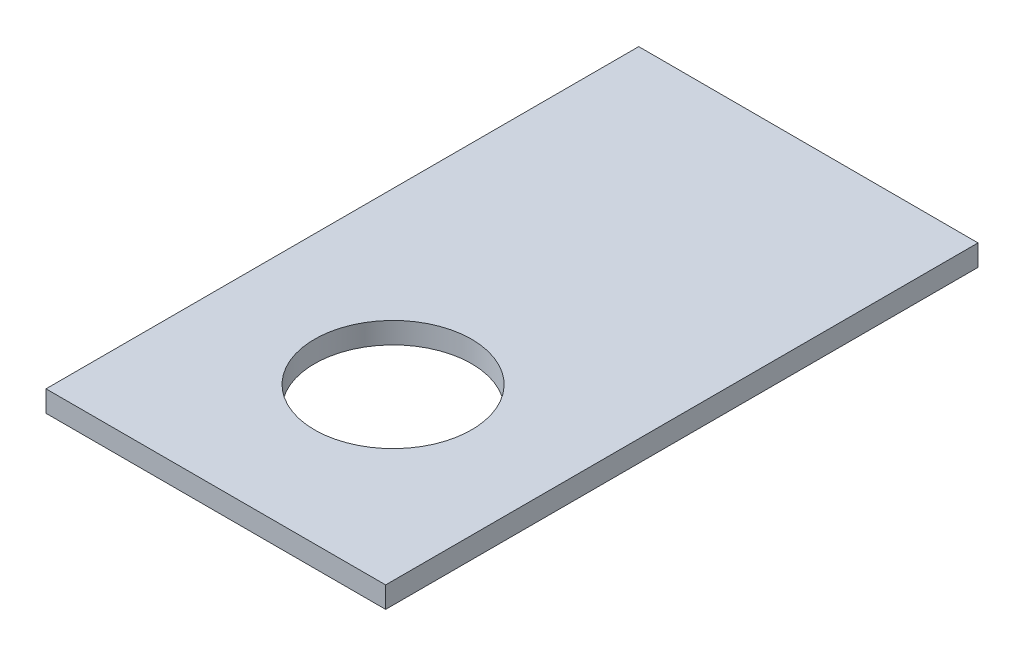
ISO-10303-21;
HEADER;
FILE_DESCRIPTION(('STEP AP214'),'2;1');
FILE_NAME('part.step','',(''),(''),'','','');
FILE_SCHEMA(('AUTOMOTIVE_DESIGN { 1 0 10303 214 1 1 1 1 }'));
ENDSEC;
DATA;
#1=APPLICATION_CONTEXT('core data for automotive mechanical design processes');
#2=APPLICATION_PROTOCOL_DEFINITION('international standard','automotive_design',2000,#1);
#3=PRODUCT_CONTEXT('',#1,'mechanical');
#4=PRODUCT('Part','Part','',(#3));
#5=PRODUCT_RELATED_PRODUCT_CATEGORY('part','',(#4));
#6=PRODUCT_DEFINITION_FORMATION('','',#4);
#7=PRODUCT_DEFINITION_CONTEXT('part definition',#1,'design');
#8=PRODUCT_DEFINITION('design','',#6,#7);
#9=PRODUCT_DEFINITION_SHAPE('','',#8);
#10=(LENGTH_UNIT() NAMED_UNIT(*) SI_UNIT(.MILLI.,.METRE.));
#11=(NAMED_UNIT(*) PLANE_ANGLE_UNIT() SI_UNIT($,.RADIAN.));
#12=(NAMED_UNIT(*) SI_UNIT($,.STERADIAN.) SOLID_ANGLE_UNIT());
#13=UNCERTAINTY_MEASURE_WITH_UNIT(LENGTH_MEASURE(1.E-05),#10,'distance_accuracy_value','');
#14=(GEOMETRIC_REPRESENTATION_CONTEXT(3) GLOBAL_UNCERTAINTY_ASSIGNED_CONTEXT((#13)) GLOBAL_UNIT_ASSIGNED_CONTEXT((#10,
#11,#12)) REPRESENTATION_CONTEXT('',''));
#15=CARTESIAN_POINT('',(0.,0.,0.));
#16=DIRECTION('',(0.,0.,1.));
#17=DIRECTION('',(1.,0.,0.));
#18=AXIS2_PLACEMENT_3D('',#15,#16,#17);
#19=CARTESIAN_POINT('',(0.,5.,0.));
#20=DIRECTION('',(0.,1.,0.));
#21=DIRECTION('',(0.,0.,1.));
#22=AXIS2_PLACEMENT_3D('',#19,#20,#21);
#23=PLANE('',#22);
#24=CARTESIAN_POINT('',(40.,5.,138.249999999999));
#25=DIRECTION('',(0.,1.,0.));
#26=DIRECTION('',(0.,0.,1.));
#27=AXIS2_PLACEMENT_3D('',#24,#25,#26);
#28=CIRCLE('',#27,18.5);
#29=CARTESIAN_POINT('',(40.,5.,156.749999999999));
#30=VERTEX_POINT('',#29);
#31=EDGE_CURVE('E99',#30,#30,#28,.T.);
#32=ORIENTED_EDGE('',*,*,#31,.F.);
#33=EDGE_LOOP('',(#32));
#34=FACE_BOUND('',#33,.T.);
#35=DIRECTION('',(0.,0.,1.));
#36=VECTOR('',#35,1.);
#37=CARTESIAN_POINT('',(0.,5.,40.3794602146901));
#38=LINE('',#37,#36);
#39=CARTESIAN_POINT('',(0.,5.,40.3794602146901));
#40=VERTEX_POINT('',#39);
#41=CARTESIAN_POINT('',(0.,5.,180.));
#42=VERTEX_POINT('',#41);
#43=EDGE_CURVE('E84',#40,#42,#38,.T.);
#44=ORIENTED_EDGE('',*,*,#43,.T.);
#45=DIRECTION('',(1.,0.,0.));
#46=VECTOR('',#45,1.);
#47=CARTESIAN_POINT('',(0.,5.,180.));
#48=LINE('',#47,#46);
#49=CARTESIAN_POINT('',(80.,5.,180.));
#50=VERTEX_POINT('',#49);
#51=EDGE_CURVE('E80',#42,#50,#48,.T.);
#52=ORIENTED_EDGE('',*,*,#51,.T.);
#53=DIRECTION('',(0.,0.,-1.));
#54=VECTOR('',#53,1.);
#55=CARTESIAN_POINT('',(80.,5.,40.4672842315765));
#56=LINE('',#55,#54);
#57=CARTESIAN_POINT('',(80.,5.,40.4672842315765));
#58=VERTEX_POINT('',#57);
#59=EDGE_CURVE('E82',#50,#58,#56,.T.);
#60=ORIENTED_EDGE('',*,*,#59,.T.);
#61=DIRECTION('',(-0.999999397417893,0.,-0.00109779954956483));
#62=VECTOR('',#61,1.);
#63=CARTESIAN_POINT('',(0.,5.,40.3794602146901));
#64=LINE('',#63,#62);
#65=EDGE_CURVE('E50',#58,#40,#64,.T.);
#66=ORIENTED_EDGE('',*,*,#65,.T.);
#67=EDGE_LOOP('',(#44,#52,#60,#66));
#68=FACE_BOUND('',#67,.T.);
#69=ADVANCED_FACE('F33',(#34,#68),#23,.T.);
#70=CARTESIAN_POINT('',(0.,0.,0.));
#71=DIRECTION('',(0.,1.,0.));
#72=DIRECTION('',(0.,0.,1.));
#73=AXIS2_PLACEMENT_3D('',#70,#71,#72);
#74=PLANE('',#73);
#75=CARTESIAN_POINT('',(40.,0.,138.249999999999));
#76=DIRECTION('',(0.,1.,0.));
#77=DIRECTION('',(0.,0.,1.));
#78=AXIS2_PLACEMENT_3D('',#75,#76,#77);
#79=CIRCLE('',#78,18.5);
#80=CARTESIAN_POINT('',(40.,0.,156.749999999999));
#81=VERTEX_POINT('',#80);
#82=EDGE_CURVE('E112',#81,#81,#79,.T.);
#83=ORIENTED_EDGE('',*,*,#82,.T.);
#84=EDGE_LOOP('',(#83));
#85=FACE_BOUND('',#84,.T.);
#86=DIRECTION('',(0.,0.,1.));
#87=VECTOR('',#86,1.);
#88=CARTESIAN_POINT('',(0.,0.,40.3794602146901));
#89=LINE('',#88,#87);
#90=CARTESIAN_POINT('',(0.,0.,40.3794602146901));
#91=VERTEX_POINT('',#90);
#92=CARTESIAN_POINT('',(0.,0.,180.));
#93=VERTEX_POINT('',#92);
#94=EDGE_CURVE('E96',#91,#93,#89,.T.);
#95=ORIENTED_EDGE('',*,*,#94,.F.);
#96=DIRECTION('',(-0.999999397417893,0.,-0.00109779954956483));
#97=VECTOR('',#96,1.);
#98=CARTESIAN_POINT('',(0.,0.,40.3794602146901));
#99=LINE('',#98,#97);
#100=CARTESIAN_POINT('',(80.,0.,40.4672842315765));
#101=VERTEX_POINT('',#100);
#102=EDGE_CURVE('E73',#101,#91,#99,.T.);
#103=ORIENTED_EDGE('',*,*,#102,.F.);
#104=DIRECTION('',(0.,0.,-1.));
#105=VECTOR('',#104,1.);
#106=CARTESIAN_POINT('',(80.,0.,40.4672842315765));
#107=LINE('',#106,#105);
#108=CARTESIAN_POINT('',(80.,0.,180.));
#109=VERTEX_POINT('',#108);
#110=EDGE_CURVE('E67',#109,#101,#107,.T.);
#111=ORIENTED_EDGE('',*,*,#110,.F.);
#112=DIRECTION('',(1.,0.,0.));
#113=VECTOR('',#112,1.);
#114=CARTESIAN_POINT('',(0.,0.,180.));
#115=LINE('',#114,#113);
#116=EDGE_CURVE('E88',#93,#109,#115,.T.);
#117=ORIENTED_EDGE('',*,*,#116,.F.);
#118=EDGE_LOOP('',(#95,#103,#111,#117));
#119=FACE_BOUND('',#118,.T.);
#120=ADVANCED_FACE('F107',(#85,#119),#74,.F.);
#121=CARTESIAN_POINT('',(0.,5.,40.3794602146901));
#122=DIRECTION('',(1.,0.,0.));
#123=DIRECTION('',(0.,0.,-1.));
#124=AXIS2_PLACEMENT_3D('',#121,#122,#123);
#125=PLANE('',#124);
#126=ORIENTED_EDGE('',*,*,#94,.T.);
#127=DIRECTION('',(0.,-1.,0.));
#128=VECTOR('',#127,1.);
#129=CARTESIAN_POINT('',(0.,5.,180.));
#130=LINE('',#129,#128);
#131=EDGE_CURVE('E11',#42,#93,#130,.T.);
#132=ORIENTED_EDGE('',*,*,#131,.F.);
#133=ORIENTED_EDGE('',*,*,#43,.F.);
#134=DIRECTION('',(0.,-1.,0.));
#135=VECTOR('',#134,1.);
#136=CARTESIAN_POINT('',(0.,5.,40.3794602146901));
#137=LINE('',#136,#135);
#138=EDGE_CURVE('E92',#40,#91,#137,.T.);
#139=ORIENTED_EDGE('',*,*,#138,.T.);
#140=EDGE_LOOP('',(#126,#132,#133,#139));
#141=FACE_BOUND('',#140,.T.);
#142=ADVANCED_FACE('F35',(#141),#125,.F.);
#143=CARTESIAN_POINT('',(0.,5.,180.));
#144=DIRECTION('',(0.,0.,-1.));
#145=DIRECTION('',(-1.,0.,0.));
#146=AXIS2_PLACEMENT_3D('',#143,#144,#145);
#147=PLANE('',#146);
#148=ORIENTED_EDGE('',*,*,#116,.T.);
#149=DIRECTION('',(0.,-1.,0.));
#150=VECTOR('',#149,1.);
#151=CARTESIAN_POINT('',(80.,5.,180.));
#152=LINE('',#151,#150);
#153=EDGE_CURVE('E42',#50,#109,#152,.T.);
#154=ORIENTED_EDGE('',*,*,#153,.F.);
#155=ORIENTED_EDGE('',*,*,#51,.F.);
#156=ORIENTED_EDGE('',*,*,#131,.T.);
#157=EDGE_LOOP('',(#148,#154,#155,#156));
#158=FACE_BOUND('',#157,.T.);
#159=ADVANCED_FACE('F87',(#158),#147,.F.);
#160=CARTESIAN_POINT('',(80.,5.,40.4672842315765));
#161=DIRECTION('',(-1.,0.,0.));
#162=DIRECTION('',(0.,0.,1.));
#163=AXIS2_PLACEMENT_3D('',#160,#161,#162);
#164=PLANE('',#163);
#165=ORIENTED_EDGE('',*,*,#110,.T.);
#166=DIRECTION('',(0.,-1.,0.));
#167=VECTOR('',#166,1.);
#168=CARTESIAN_POINT('',(80.,5.,40.4672842315765));
#169=LINE('',#168,#167);
#170=EDGE_CURVE('E89',#58,#101,#169,.T.);
#171=ORIENTED_EDGE('',*,*,#170,.F.);
#172=ORIENTED_EDGE('',*,*,#59,.F.);
#173=ORIENTED_EDGE('',*,*,#153,.T.);
#174=EDGE_LOOP('',(#165,#171,#172,#173));
#175=FACE_BOUND('',#174,.T.);
#176=ADVANCED_FACE('F90',(#175),#164,.F.);
#177=CARTESIAN_POINT('',(0.,5.,40.3794602146901));
#178=DIRECTION('',(-0.00109779954956483,0.,0.999999397417893));
#179=DIRECTION('',(0.999999397417893,0.,0.00109779954956483));
#180=AXIS2_PLACEMENT_3D('',#177,#178,#179);
#181=PLANE('',#180);
#182=ORIENTED_EDGE('',*,*,#102,.T.);
#183=ORIENTED_EDGE('',*,*,#138,.F.);
#184=ORIENTED_EDGE('',*,*,#65,.F.);
#185=ORIENTED_EDGE('',*,*,#170,.T.);
#186=EDGE_LOOP('',(#182,#183,#184,#185));
#187=FACE_BOUND('',#186,.T.);
#188=ADVANCED_FACE('F104',(#187),#181,.F.);
#189=CARTESIAN_POINT('',(40.,0.,138.249999999999));
#190=DIRECTION('',(0.,1.,0.));
#191=DIRECTION('',(0.,0.,1.));
#192=AXIS2_PLACEMENT_3D('',#189,#190,#191);
#193=CYLINDRICAL_SURFACE('',#192,18.5);
#194=ORIENTED_EDGE('',*,*,#31,.T.);
#195=EDGE_LOOP('',(#194));
#196=FACE_BOUND('',#195,.T.);
#197=ORIENTED_EDGE('',*,*,#82,.F.);
#198=EDGE_LOOP('',(#197));
#199=FACE_BOUND('',#198,.T.);
#200=ADVANCED_FACE('F117',(#196,#199),#193,.F.);
#201=CLOSED_SHELL('',(#69,#120,#142,#159,#176,#188,#200));
#202=MANIFOLD_SOLID_BREP('B2',#201);
#203=ADVANCED_BREP_SHAPE_REPRESENTATION('',(#18,#202),#14);
#204=SHAPE_DEFINITION_REPRESENTATION(#9,#203);
ENDSEC;
END-ISO-10303-21;
